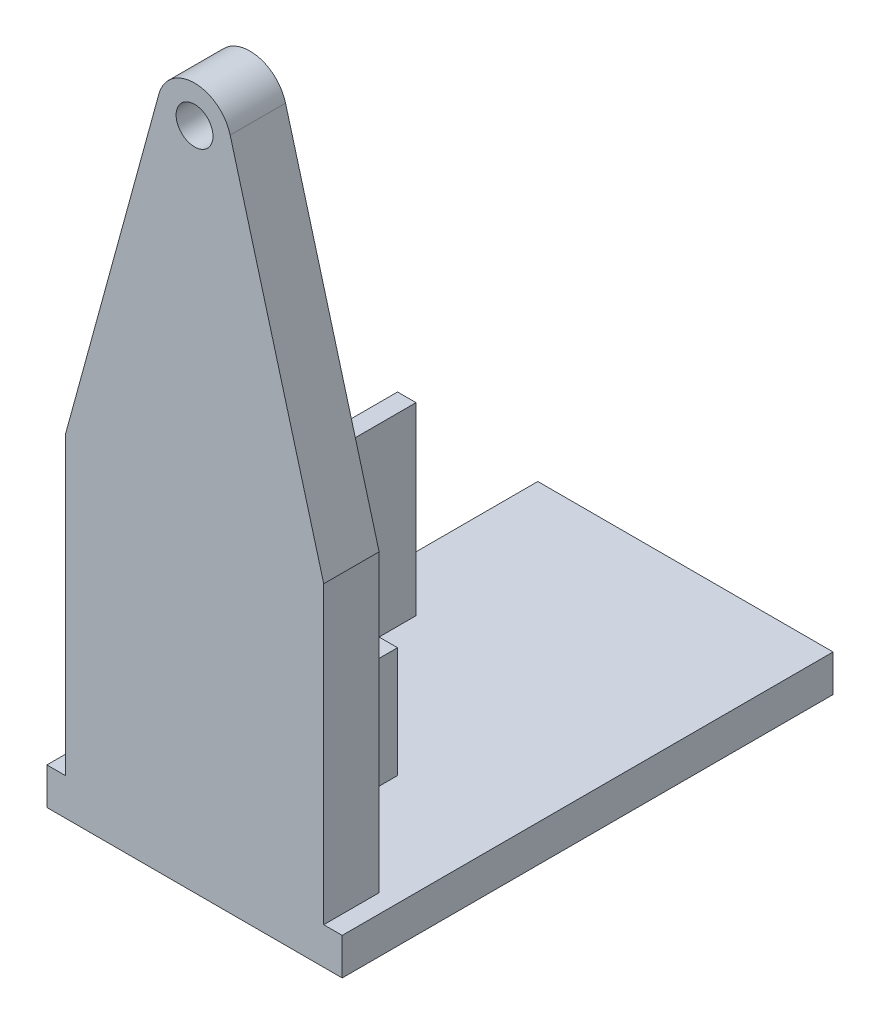
ISO-10303-21;
HEADER;
FILE_DESCRIPTION(('STEP AP214'),'2;1');
FILE_NAME('part.step','',(''),(''),'','','');
FILE_SCHEMA(('AUTOMOTIVE_DESIGN { 1 0 10303 214 1 1 1 1 }'));
ENDSEC;
DATA;
#1=APPLICATION_CONTEXT('core data for automotive mechanical design processes');
#2=APPLICATION_PROTOCOL_DEFINITION('international standard','automotive_design',2000,#1);
#3=PRODUCT_CONTEXT('',#1,'mechanical');
#4=PRODUCT('Part','Part','',(#3));
#5=PRODUCT_RELATED_PRODUCT_CATEGORY('part','',(#4));
#6=PRODUCT_DEFINITION_FORMATION('','',#4);
#7=PRODUCT_DEFINITION_CONTEXT('part definition',#1,'design');
#8=PRODUCT_DEFINITION('design','',#6,#7);
#9=PRODUCT_DEFINITION_SHAPE('','',#8);
#10=(LENGTH_UNIT() NAMED_UNIT(*) SI_UNIT(.MILLI.,.METRE.));
#11=(NAMED_UNIT(*) PLANE_ANGLE_UNIT() SI_UNIT($,.RADIAN.));
#12=(NAMED_UNIT(*) SI_UNIT($,.STERADIAN.) SOLID_ANGLE_UNIT());
#13=UNCERTAINTY_MEASURE_WITH_UNIT(LENGTH_MEASURE(1.E-05),#10,'distance_accuracy_value','');
#14=(GEOMETRIC_REPRESENTATION_CONTEXT(3) GLOBAL_UNCERTAINTY_ASSIGNED_CONTEXT((#13)) GLOBAL_UNIT_ASSIGNED_CONTEXT((#10,
#11,#12)) REPRESENTATION_CONTEXT('',''));
#15=CARTESIAN_POINT('',(0.,0.,0.));
#16=DIRECTION('',(0.,0.,1.));
#17=DIRECTION('',(1.,0.,0.));
#18=AXIS2_PLACEMENT_3D('',#15,#16,#17);
#19=CARTESIAN_POINT('',(0.,0.,0.));
#20=DIRECTION('',(0.,0.,1.));
#21=DIRECTION('',(1.,0.,0.));
#22=AXIS2_PLACEMENT_3D('',#19,#20,#21);
#23=PLANE('',#22);
#24=DIRECTION('',(0.,-1.,0.));
#25=VECTOR('',#24,1.);
#26=CARTESIAN_POINT('',(-10.,50.,0.));
#27=LINE('',#26,#25);
#28=CARTESIAN_POINT('',(-10.,100.,0.));
#29=VERTEX_POINT('',#28);
#30=CARTESIAN_POINT('',(-10.,50.,0.));
#31=VERTEX_POINT('',#30);
#32=EDGE_CURVE('E331',#29,#31,#27,.T.);
#33=ORIENTED_EDGE('',*,*,#32,.F.);
#34=DIRECTION('',(1.,0.,0.));
#35=VECTOR('',#34,1.);
#36=CARTESIAN_POINT('',(-10.,100.,0.));
#37=LINE('',#36,#35);
#38=CARTESIAN_POINT('',(-15.,100.,0.));
#39=VERTEX_POINT('',#38);
#40=EDGE_CURVE('E347',#39,#29,#37,.T.);
#41=ORIENTED_EDGE('',*,*,#40,.F.);
#42=DIRECTION('',(0.,1.,0.));
#43=VECTOR('',#42,1.);
#44=CARTESIAN_POINT('',(-15.,50.,0.));
#45=LINE('',#44,#43);
#46=CARTESIAN_POINT('',(-15.,50.,0.));
#47=VERTEX_POINT('',#46);
#48=EDGE_CURVE('E360',#47,#39,#45,.T.);
#49=ORIENTED_EDGE('',*,*,#48,.F.);
#50=DIRECTION('',(-1.,0.,0.));
#51=VECTOR('',#50,1.);
#52=CARTESIAN_POINT('',(-10.,50.,0.));
#53=LINE('',#52,#51);
#54=EDGE_CURVE('E336',#31,#47,#53,.T.);
#55=ORIENTED_EDGE('',*,*,#54,.F.);
#56=EDGE_LOOP('',(#33,#41,#49,#55));
#57=FACE_BOUND('',#56,.T.);
#58=CARTESIAN_POINT('',(0.,180.,0.));
#59=DIRECTION('',(0.,0.,1.));
#60=DIRECTION('',(1.,0.,0.));
#61=AXIS2_PLACEMENT_3D('',#58,#59,#60);
#62=CIRCLE('',#61,5.);
#63=CARTESIAN_POINT('',(5.,180.,0.));
#64=VERTEX_POINT('',#63);
#65=EDGE_CURVE('E435',#64,#64,#62,.T.);
#66=ORIENTED_EDGE('',*,*,#65,.T.);
#67=EDGE_LOOP('',(#66));
#68=FACE_BOUND('',#67,.T.);
#69=DIRECTION('',(0.,1.,0.));
#70=VECTOR('',#69,1.);
#71=CARTESIAN_POINT('',(-10.,10.,0.));
#72=LINE('',#71,#70);
#73=CARTESIAN_POINT('',(-10.,10.,0.));
#74=VERTEX_POINT('',#73);
#75=CARTESIAN_POINT('',(-10.,40.,0.));
#76=VERTEX_POINT('',#75);
#77=EDGE_CURVE('E382',#74,#76,#72,.T.);
#78=ORIENTED_EDGE('',*,*,#77,.F.);
#79=DIRECTION('',(1.,0.,0.));
#80=VECTOR('',#79,1.);
#81=CARTESIAN_POINT('',(40.,10.,0.));
#82=LINE('',#81,#80);
#83=CARTESIAN_POINT('',(-35.,10.,0.));
#84=VERTEX_POINT('',#83);
#85=EDGE_CURVE('E12',#84,#74,#82,.T.);
#86=ORIENTED_EDGE('',*,*,#85,.F.);
#87=DIRECTION('',(0.,1.,0.));
#88=VECTOR('',#87,1.);
#89=CARTESIAN_POINT('',(-35.,0.,0.));
#90=LINE('',#89,#88);
#91=CARTESIAN_POINT('',(-35.,90.,0.));
#92=VERTEX_POINT('',#91);
#93=EDGE_CURVE('E441',#84,#92,#90,.T.);
#94=ORIENTED_EDGE('',*,*,#93,.T.);
#95=DIRECTION('',(0.26398286591445,0.9645273694943,0.));
#96=VECTOR('',#95,1.);
#97=CARTESIAN_POINT('',(-55.4766395603085,15.1834802884977,0.));
#98=LINE('',#97,#96);
#99=CARTESIAN_POINT('',(-9.64527369494302,182.639828659144,0.));
#100=VERTEX_POINT('',#99);
#101=EDGE_CURVE('E472',#92,#100,#98,.T.);
#102=ORIENTED_EDGE('',*,*,#101,.T.);
#103=CARTESIAN_POINT('',(0.,180.,0.));
#104=DIRECTION('',(0.,0.,1.));
#105=DIRECTION('',(1.,0.,0.));
#106=AXIS2_PLACEMENT_3D('',#103,#104,#105);
#107=CIRCLE('',#106,10.);
#108=CARTESIAN_POINT('',(9.65615758520671,182.599734734479,0.));
#109=VERTEX_POINT('',#108);
#110=EDGE_CURVE('E159',#109,#100,#107,.T.);
#111=ORIENTED_EDGE('',*,*,#110,.F.);
#112=DIRECTION('',(-0.263983732927113,0.964527132199954,0.));
#113=VECTOR('',#112,1.);
#114=CARTESIAN_POINT('',(55.4766931643317,15.1835485628789,0.));
#115=LINE('',#114,#113);
#116=CARTESIAN_POINT('',(35.,90.,0.));
#117=VERTEX_POINT('',#116);
#118=EDGE_CURVE('E467',#117,#109,#115,.T.);
#119=ORIENTED_EDGE('',*,*,#118,.F.);
#120=DIRECTION('',(0.,1.,0.));
#121=VECTOR('',#120,1.);
#122=CARTESIAN_POINT('',(35.,0.,0.));
#123=LINE('',#122,#121);
#124=CARTESIAN_POINT('',(35.,10.,0.));
#125=VERTEX_POINT('',#124);
#126=EDGE_CURVE('E464',#125,#117,#123,.T.);
#127=ORIENTED_EDGE('',*,*,#126,.F.);
#128=CARTESIAN_POINT('',(9.99999999999999,10.,0.));
#129=VERTEX_POINT('',#128);
#130=EDGE_CURVE('E165',#129,#125,#82,.T.);
#131=ORIENTED_EDGE('',*,*,#130,.F.);
#132=DIRECTION('',(0.,-1.,0.));
#133=VECTOR('',#132,1.);
#134=CARTESIAN_POINT('',(9.99999999999999,10.,0.));
#135=LINE('',#134,#133);
#136=CARTESIAN_POINT('',(10.,40.,0.));
#137=VERTEX_POINT('',#136);
#138=EDGE_CURVE('E388',#137,#129,#135,.T.);
#139=ORIENTED_EDGE('',*,*,#138,.F.);
#140=DIRECTION('',(1.,0.,0.));
#141=VECTOR('',#140,1.);
#142=CARTESIAN_POINT('',(-10.,40.,0.));
#143=LINE('',#142,#141);
#144=EDGE_CURVE('E402',#76,#137,#143,.T.);
#145=ORIENTED_EDGE('',*,*,#144,.F.);
#146=EDGE_LOOP('',(#78,#86,#94,#102,#111,#119,#127,#131,#139,#145));
#147=FACE_BOUND('',#146,.T.);
#148=DIRECTION('',(0.,1.,0.));
#149=VECTOR('',#148,1.);
#150=CARTESIAN_POINT('',(9.99999999999999,50.,0.));
#151=LINE('',#150,#149);
#152=CARTESIAN_POINT('',(9.99999999999999,50.,0.));
#153=VERTEX_POINT('',#152);
#154=CARTESIAN_POINT('',(9.99999999999999,100.,0.));
#155=VERTEX_POINT('',#154);
#156=EDGE_CURVE('E329',#153,#155,#151,.T.);
#157=ORIENTED_EDGE('',*,*,#156,.F.);
#158=DIRECTION('',(-1.,0.,0.));
#159=VECTOR('',#158,1.);
#160=CARTESIAN_POINT('',(9.99999999999999,50.,0.));
#161=LINE('',#160,#159);
#162=CARTESIAN_POINT('',(15.,50.,0.));
#163=VERTEX_POINT('',#162);
#164=EDGE_CURVE('E326',#163,#153,#161,.T.);
#165=ORIENTED_EDGE('',*,*,#164,.F.);
#166=DIRECTION('',(0.,-1.,0.));
#167=VECTOR('',#166,1.);
#168=CARTESIAN_POINT('',(15.,50.,0.));
#169=LINE('',#168,#167);
#170=CARTESIAN_POINT('',(15.,100.,0.));
#171=VERTEX_POINT('',#170);
#172=EDGE_CURVE('E178',#171,#163,#169,.T.);
#173=ORIENTED_EDGE('',*,*,#172,.F.);
#174=DIRECTION('',(1.,0.,0.));
#175=VECTOR('',#174,1.);
#176=CARTESIAN_POINT('',(9.99999999999999,100.,0.));
#177=LINE('',#176,#175);
#178=EDGE_CURVE('E173',#155,#171,#177,.T.);
#179=ORIENTED_EDGE('',*,*,#178,.F.);
#180=EDGE_LOOP('',(#157,#165,#173,#179));
#181=FACE_BOUND('',#180,.T.);
#182=ADVANCED_FACE('F155',(#57,#68,#147,#181),#23,.F.);
#183=CARTESIAN_POINT('',(0.,10.,15.));
#184=DIRECTION('',(0.,-1.,0.));
#185=DIRECTION('',(0.,0.,-1.));
#186=AXIS2_PLACEMENT_3D('',#183,#184,#185);
#187=PLANE('',#186);
#188=DIRECTION('',(0.,0.,1.));
#189=VECTOR('',#188,1.);
#190=CARTESIAN_POINT('',(-10.,10.,-30.));
#191=LINE('',#190,#189);
#192=CARTESIAN_POINT('',(-10.,10.,-30.));
#193=VERTEX_POINT('',#192);
#194=EDGE_CURVE('E398',#193,#74,#191,.T.);
#195=ORIENTED_EDGE('',*,*,#194,.F.);
#196=DIRECTION('',(-1.,0.,0.));
#197=VECTOR('',#196,1.);
#198=CARTESIAN_POINT('',(9.99999999999999,10.,-30.));
#199=LINE('',#198,#197);
#200=CARTESIAN_POINT('',(10.,10.,-30.));
#201=VERTEX_POINT('',#200);
#202=EDGE_CURVE('E395',#201,#193,#199,.T.);
#203=ORIENTED_EDGE('',*,*,#202,.F.);
#204=DIRECTION('',(0.,0.,1.));
#205=VECTOR('',#204,1.);
#206=CARTESIAN_POINT('',(9.99999999999999,10.,-30.));
#207=LINE('',#206,#205);
#208=EDGE_CURVE('E409',#201,#129,#207,.T.);
#209=ORIENTED_EDGE('',*,*,#208,.T.);
#210=ORIENTED_EDGE('',*,*,#130,.T.);
#211=DIRECTION('',(0.,0.,-1.));
#212=VECTOR('',#211,1.);
#213=CARTESIAN_POINT('',(35.,10.,15.));
#214=LINE('',#213,#212);
#215=CARTESIAN_POINT('',(35.,10.,15.));
#216=VERTEX_POINT('',#215);
#217=EDGE_CURVE('E495',#216,#125,#214,.T.);
#218=ORIENTED_EDGE('',*,*,#217,.F.);
#219=DIRECTION('',(-1.,0.,0.));
#220=VECTOR('',#219,1.);
#221=CARTESIAN_POINT('',(0.,10.,15.));
#222=LINE('',#221,#220);
#223=CARTESIAN_POINT('',(40.,10.,15.));
#224=VERTEX_POINT('',#223);
#225=EDGE_CURVE('E444',#224,#216,#222,.T.);
#226=ORIENTED_EDGE('',*,*,#225,.F.);
#227=DIRECTION('',(0.,0.,-1.));
#228=VECTOR('',#227,1.);
#229=CARTESIAN_POINT('',(40.,10.,15.));
#230=LINE('',#229,#228);
#231=CARTESIAN_POINT('',(40.,10.,-118.));
#232=VERTEX_POINT('',#231);
#233=EDGE_CURVE('E499',#224,#232,#230,.T.);
#234=ORIENTED_EDGE('',*,*,#233,.T.);
#235=DIRECTION('',(1.,0.,0.));
#236=VECTOR('',#235,1.);
#237=CARTESIAN_POINT('',(40.,10.,-118.));
#238=LINE('',#237,#236);
#239=CARTESIAN_POINT('',(-40.,10.,-118.));
#240=VERTEX_POINT('',#239);
#241=EDGE_CURVE('E432',#240,#232,#238,.T.);
#242=ORIENTED_EDGE('',*,*,#241,.F.);
#243=DIRECTION('',(0.,0.,-1.));
#244=VECTOR('',#243,1.);
#245=CARTESIAN_POINT('',(-40.,10.,15.));
#246=LINE('',#245,#244);
#247=CARTESIAN_POINT('',(-40.,10.,15.));
#248=VERTEX_POINT('',#247);
#249=EDGE_CURVE('E513',#248,#240,#246,.T.);
#250=ORIENTED_EDGE('',*,*,#249,.F.);
#251=DIRECTION('',(-1.,0.,0.));
#252=VECTOR('',#251,1.);
#253=CARTESIAN_POINT('',(40.,10.,15.));
#254=LINE('',#253,#252);
#255=CARTESIAN_POINT('',(-35.,10.,15.));
#256=VERTEX_POINT('',#255);
#257=EDGE_CURVE('E509',#256,#248,#254,.T.);
#258=ORIENTED_EDGE('',*,*,#257,.F.);
#259=DIRECTION('',(0.,0.,-1.));
#260=VECTOR('',#259,1.);
#261=CARTESIAN_POINT('',(-35.,10.,15.));
#262=LINE('',#261,#260);
#263=EDGE_CURVE('E463',#256,#84,#262,.T.);
#264=ORIENTED_EDGE('',*,*,#263,.T.);
#265=ORIENTED_EDGE('',*,*,#85,.T.);
#266=EDGE_LOOP('',(#195,#203,#209,#210,#218,#226,#234,#242,#250,#258,#264,#265));
#267=FACE_BOUND('',#266,.T.);
#268=ADVANCED_FACE('F549',(#267),#187,.F.);
#269=CARTESIAN_POINT('',(0.,0.,15.));
#270=DIRECTION('',(0.,1.,0.));
#271=DIRECTION('',(0.,0.,1.));
#272=AXIS2_PLACEMENT_3D('',#269,#270,#271);
#273=PLANE('',#272);
#274=DIRECTION('',(0.,0.,-1.));
#275=VECTOR('',#274,1.);
#276=CARTESIAN_POINT('',(-40.,0.,15.));
#277=LINE('',#276,#275);
#278=CARTESIAN_POINT('',(-40.,0.,15.));
#279=VERTEX_POINT('',#278);
#280=CARTESIAN_POINT('',(-40.,0.,-118.));
#281=VERTEX_POINT('',#280);
#282=EDGE_CURVE('E468',#279,#281,#277,.T.);
#283=ORIENTED_EDGE('',*,*,#282,.T.);
#284=DIRECTION('',(-1.,0.,0.));
#285=VECTOR('',#284,1.);
#286=CARTESIAN_POINT('',(40.,0.,-118.));
#287=LINE('',#286,#285);
#288=CARTESIAN_POINT('',(40.,0.,-118.));
#289=VERTEX_POINT('',#288);
#290=EDGE_CURVE('E424',#289,#281,#287,.T.);
#291=ORIENTED_EDGE('',*,*,#290,.F.);
#292=DIRECTION('',(0.,0.,-1.));
#293=VECTOR('',#292,1.);
#294=CARTESIAN_POINT('',(40.,0.,15.));
#295=LINE('',#294,#293);
#296=CARTESIAN_POINT('',(40.,0.,15.));
#297=VERTEX_POINT('',#296);
#298=EDGE_CURVE('E502',#297,#289,#295,.T.);
#299=ORIENTED_EDGE('',*,*,#298,.F.);
#300=DIRECTION('',(1.,0.,0.));
#301=VECTOR('',#300,1.);
#302=CARTESIAN_POINT('',(0.,0.,15.));
#303=LINE('',#302,#301);
#304=EDGE_CURVE('E437',#279,#297,#303,.T.);
#305=ORIENTED_EDGE('',*,*,#304,.F.);
#306=EDGE_LOOP('',(#283,#291,#299,#305));
#307=FACE_BOUND('',#306,.T.);
#308=ADVANCED_FACE('F559',(#307),#273,.F.);
#309=CARTESIAN_POINT('',(40.,0.,15.));
#310=DIRECTION('',(-1.,0.,0.));
#311=DIRECTION('',(0.,0.,1.));
#312=AXIS2_PLACEMENT_3D('',#309,#310,#311);
#313=PLANE('',#312);
#314=ORIENTED_EDGE('',*,*,#298,.T.);
#315=DIRECTION('',(0.,-1.,0.));
#316=VECTOR('',#315,1.);
#317=CARTESIAN_POINT('',(40.,0.,-118.));
#318=LINE('',#317,#316);
#319=EDGE_CURVE('E420',#232,#289,#318,.T.);
#320=ORIENTED_EDGE('',*,*,#319,.F.);
#321=ORIENTED_EDGE('',*,*,#233,.F.);
#322=DIRECTION('',(0.,1.,0.));
#323=VECTOR('',#322,1.);
#324=CARTESIAN_POINT('',(40.,0.,15.));
#325=LINE('',#324,#323);
#326=EDGE_CURVE('E440',#297,#224,#325,.T.);
#327=ORIENTED_EDGE('',*,*,#326,.F.);
#328=EDGE_LOOP('',(#314,#320,#321,#327));
#329=FACE_BOUND('',#328,.T.);
#330=ADVANCED_FACE('F565',(#329),#313,.F.);
#331=CARTESIAN_POINT('',(55.4766931643317,15.1835485628789,15.));
#332=DIRECTION('',(-0.964527132199954,-0.263983732927113,0.));
#333=DIRECTION('',(0.263983732927113,-0.964527132199954,0.));
#334=AXIS2_PLACEMENT_3D('',#331,#332,#333);
#335=PLANE('',#334);
#336=ORIENTED_EDGE('',*,*,#118,.T.);
#337=DIRECTION('',(0.,0.,-1.));
#338=VECTOR('',#337,1.);
#339=CARTESIAN_POINT('',(9.65615758520671,182.599734734479,15.));
#340=LINE('',#339,#338);
#341=CARTESIAN_POINT('',(9.65615758520671,182.599734734479,15.));
#342=VERTEX_POINT('',#341);
#343=EDGE_CURVE('E488',#342,#109,#340,.T.);
#344=ORIENTED_EDGE('',*,*,#343,.F.);
#345=DIRECTION('',(-0.263983732927113,0.964527132199954,0.));
#346=VECTOR('',#345,1.);
#347=CARTESIAN_POINT('',(55.4766931643317,15.1835485628789,15.));
#348=LINE('',#347,#346);
#349=CARTESIAN_POINT('',(35.,90.,15.));
#350=VERTEX_POINT('',#349);
#351=EDGE_CURVE('E451',#350,#342,#348,.T.);
#352=ORIENTED_EDGE('',*,*,#351,.F.);
#353=DIRECTION('',(0.,0.,-1.));
#354=VECTOR('',#353,1.);
#355=CARTESIAN_POINT('',(35.,90.,15.));
#356=LINE('',#355,#354);
#357=EDGE_CURVE('E491',#350,#117,#356,.T.);
#358=ORIENTED_EDGE('',*,*,#357,.T.);
#359=EDGE_LOOP('',(#336,#344,#352,#358));
#360=FACE_BOUND('',#359,.T.);
#361=ADVANCED_FACE('F575',(#360),#335,.F.);
#362=CARTESIAN_POINT('',(-55.4766395603085,15.1834802884977,15.));
#363=DIRECTION('',(-0.9645273694943,0.26398286591445,0.));
#364=DIRECTION('',(-0.26398286591445,-0.9645273694943,0.));
#365=AXIS2_PLACEMENT_3D('',#362,#363,#364);
#366=PLANE('',#365);
#367=ORIENTED_EDGE('',*,*,#101,.F.);
#368=DIRECTION('',(0.,0.,-1.));
#369=VECTOR('',#368,1.);
#370=CARTESIAN_POINT('',(-35.,90.,15.));
#371=LINE('',#370,#369);
#372=CARTESIAN_POINT('',(-35.,90.,15.));
#373=VERTEX_POINT('',#372);
#374=EDGE_CURVE('E482',#373,#92,#371,.T.);
#375=ORIENTED_EDGE('',*,*,#374,.F.);
#376=DIRECTION('',(0.26398286591445,0.9645273694943,0.));
#377=VECTOR('',#376,1.);
#378=CARTESIAN_POINT('',(-55.4766395603085,15.1834802884977,15.));
#379=LINE('',#378,#377);
#380=CARTESIAN_POINT('',(-9.64527369494302,182.639828659144,15.));
#381=VERTEX_POINT('',#380);
#382=EDGE_CURVE('E455',#373,#381,#379,.T.);
#383=ORIENTED_EDGE('',*,*,#382,.T.);
#384=DIRECTION('',(0.,0.,-1.));
#385=VECTOR('',#384,1.);
#386=CARTESIAN_POINT('',(-9.64527369494302,182.639828659144,15.));
#387=LINE('',#386,#385);
#388=EDGE_CURVE('E485',#381,#100,#387,.T.);
#389=ORIENTED_EDGE('',*,*,#388,.T.);
#390=EDGE_LOOP('',(#367,#375,#383,#389));
#391=FACE_BOUND('',#390,.T.);
#392=ADVANCED_FACE('F539',(#391),#366,.T.);
#393=CARTESIAN_POINT('',(-35.,0.,15.));
#394=DIRECTION('',(-1.,0.,0.));
#395=DIRECTION('',(0.,0.,1.));
#396=AXIS2_PLACEMENT_3D('',#393,#394,#395);
#397=PLANE('',#396);
#398=ORIENTED_EDGE('',*,*,#93,.F.);
#399=ORIENTED_EDGE('',*,*,#263,.F.);
#400=DIRECTION('',(0.,1.,0.));
#401=VECTOR('',#400,1.);
#402=CARTESIAN_POINT('',(-35.,0.,15.));
#403=LINE('',#402,#401);
#404=EDGE_CURVE('E459',#256,#373,#403,.T.);
#405=ORIENTED_EDGE('',*,*,#404,.T.);
#406=ORIENTED_EDGE('',*,*,#374,.T.);
#407=EDGE_LOOP('',(#398,#399,#405,#406));
#408=FACE_BOUND('',#407,.T.);
#409=ADVANCED_FACE('F544',(#408),#397,.T.);
#410=CARTESIAN_POINT('',(35.,0.,15.));
#411=DIRECTION('',(-1.,0.,0.));
#412=DIRECTION('',(0.,0.,1.));
#413=AXIS2_PLACEMENT_3D('',#410,#411,#412);
#414=PLANE('',#413);
#415=ORIENTED_EDGE('',*,*,#126,.T.);
#416=ORIENTED_EDGE('',*,*,#357,.F.);
#417=DIRECTION('',(0.,1.,0.));
#418=VECTOR('',#417,1.);
#419=CARTESIAN_POINT('',(35.,0.,15.));
#420=LINE('',#419,#418);
#421=EDGE_CURVE('E448',#216,#350,#420,.T.);
#422=ORIENTED_EDGE('',*,*,#421,.F.);
#423=ORIENTED_EDGE('',*,*,#217,.T.);
#424=EDGE_LOOP('',(#415,#416,#422,#423));
#425=FACE_BOUND('',#424,.T.);
#426=ADVANCED_FACE('F571',(#425),#414,.F.);
#427=CARTESIAN_POINT('',(0.,0.,15.));
#428=DIRECTION('',(0.,0.,1.));
#429=DIRECTION('',(1.,0.,0.));
#430=AXIS2_PLACEMENT_3D('',#427,#428,#429);
#431=PLANE('',#430);
#432=ORIENTED_EDGE('',*,*,#404,.F.);
#433=ORIENTED_EDGE('',*,*,#257,.T.);
#434=DIRECTION('',(0.,1.,0.));
#435=VECTOR('',#434,1.);
#436=CARTESIAN_POINT('',(-40.,0.,15.));
#437=LINE('',#436,#435);
#438=EDGE_CURVE('E505',#279,#248,#437,.T.);
#439=ORIENTED_EDGE('',*,*,#438,.F.);
#440=ORIENTED_EDGE('',*,*,#304,.T.);
#441=ORIENTED_EDGE('',*,*,#326,.T.);
#442=ORIENTED_EDGE('',*,*,#225,.T.);
#443=ORIENTED_EDGE('',*,*,#421,.T.);
#444=ORIENTED_EDGE('',*,*,#351,.T.);
#445=CARTESIAN_POINT('',(0.,180.,15.));
#446=DIRECTION('',(0.,0.,1.));
#447=DIRECTION('',(1.,0.,0.));
#448=AXIS2_PLACEMENT_3D('',#445,#446,#447);
#449=CIRCLE('',#448,10.);
#450=EDGE_CURVE('E510',#342,#381,#449,.T.);
#451=ORIENTED_EDGE('',*,*,#450,.T.);
#452=ORIENTED_EDGE('',*,*,#382,.F.);
#453=EDGE_LOOP('',(#432,#433,#439,#440,#441,#442,#443,#444,#451,#452));
#454=FACE_BOUND('',#453,.T.);
#455=CARTESIAN_POINT('',(0.,180.,15.));
#456=DIRECTION('',(0.,0.,1.));
#457=DIRECTION('',(1.,0.,0.));
#458=AXIS2_PLACEMENT_3D('',#455,#456,#457);
#459=CIRCLE('',#458,5.);
#460=CARTESIAN_POINT('',(5.,180.,15.));
#461=VERTEX_POINT('',#460);
#462=EDGE_CURVE('E518',#461,#461,#459,.T.);
#463=ORIENTED_EDGE('',*,*,#462,.F.);
#464=EDGE_LOOP('',(#463));
#465=FACE_BOUND('',#464,.T.);
#466=ADVANCED_FACE('F541',(#454,#465),#431,.T.);
#467=CARTESIAN_POINT('',(0.,180.,15.));
#468=DIRECTION('',(0.,0.,-1.));
#469=DIRECTION('',(-1.,0.,0.));
#470=AXIS2_PLACEMENT_3D('',#467,#468,#469);
#471=CYLINDRICAL_SURFACE('',#470,5.);
#472=ORIENTED_EDGE('',*,*,#462,.T.);
#473=EDGE_LOOP('',(#472));
#474=FACE_BOUND('',#473,.T.);
#475=ORIENTED_EDGE('',*,*,#65,.F.);
#476=EDGE_LOOP('',(#475));
#477=FACE_BOUND('',#476,.T.);
#478=ADVANCED_FACE('F624',(#474,#477),#471,.F.);
#479=CARTESIAN_POINT('',(0.,180.,15.));
#480=DIRECTION('',(0.,0.,-1.));
#481=DIRECTION('',(-1.,0.,0.));
#482=AXIS2_PLACEMENT_3D('',#479,#480,#481);
#483=CYLINDRICAL_SURFACE('',#482,10.);
#484=ORIENTED_EDGE('',*,*,#450,.F.);
#485=ORIENTED_EDGE('',*,*,#343,.T.);
#486=ORIENTED_EDGE('',*,*,#110,.T.);
#487=ORIENTED_EDGE('',*,*,#388,.F.);
#488=EDGE_LOOP('',(#484,#485,#486,#487));
#489=FACE_BOUND('',#488,.T.);
#490=ADVANCED_FACE('F157',(#489),#483,.T.);
#491=CARTESIAN_POINT('',(-40.,0.,15.));
#492=DIRECTION('',(-1.,0.,0.));
#493=DIRECTION('',(0.,0.,1.));
#494=AXIS2_PLACEMENT_3D('',#491,#492,#493);
#495=PLANE('',#494);
#496=ORIENTED_EDGE('',*,*,#249,.T.);
#497=DIRECTION('',(0.,1.,0.));
#498=VECTOR('',#497,1.);
#499=CARTESIAN_POINT('',(-40.,0.,-118.));
#500=LINE('',#499,#498);
#501=EDGE_CURVE('E428',#281,#240,#500,.T.);
#502=ORIENTED_EDGE('',*,*,#501,.F.);
#503=ORIENTED_EDGE('',*,*,#282,.F.);
#504=ORIENTED_EDGE('',*,*,#438,.T.);
#505=EDGE_LOOP('',(#496,#502,#503,#504));
#506=FACE_BOUND('',#505,.T.);
#507=ADVANCED_FACE('F555',(#506),#495,.T.);
#508=CARTESIAN_POINT('',(0.,0.,-118.));
#509=DIRECTION('',(0.,0.,1.));
#510=DIRECTION('',(1.,0.,0.));
#511=AXIS2_PLACEMENT_3D('',#508,#509,#510);
#512=PLANE('',#511);
#513=ORIENTED_EDGE('',*,*,#319,.T.);
#514=ORIENTED_EDGE('',*,*,#290,.T.);
#515=ORIENTED_EDGE('',*,*,#501,.T.);
#516=ORIENTED_EDGE('',*,*,#241,.T.);
#517=EDGE_LOOP('',(#513,#514,#515,#516));
#518=FACE_BOUND('',#517,.T.);
#519=ADVANCED_FACE('F561',(#518),#512,.F.);
#520=CARTESIAN_POINT('',(-10.,10.,-30.));
#521=DIRECTION('',(1.,0.,0.));
#522=DIRECTION('',(0.,0.,-1.));
#523=AXIS2_PLACEMENT_3D('',#520,#521,#522);
#524=PLANE('',#523);
#525=ORIENTED_EDGE('',*,*,#77,.T.);
#526=DIRECTION('',(0.,0.,1.));
#527=VECTOR('',#526,1.);
#528=CARTESIAN_POINT('',(-10.,40.,-30.));
#529=LINE('',#528,#527);
#530=CARTESIAN_POINT('',(-10.,40.,-30.));
#531=VERTEX_POINT('',#530);
#532=EDGE_CURVE('E417',#531,#76,#529,.T.);
#533=ORIENTED_EDGE('',*,*,#532,.F.);
#534=DIRECTION('',(0.,1.,0.));
#535=VECTOR('',#534,1.);
#536=CARTESIAN_POINT('',(-10.,10.,-30.));
#537=LINE('',#536,#535);
#538=EDGE_CURVE('E383',#193,#531,#537,.T.);
#539=ORIENTED_EDGE('',*,*,#538,.F.);
#540=ORIENTED_EDGE('',*,*,#194,.T.);
#541=EDGE_LOOP('',(#525,#533,#539,#540));
#542=FACE_BOUND('',#541,.T.);
#543=ADVANCED_FACE('F592',(#542),#524,.F.);
#544=CARTESIAN_POINT('',(-10.,40.,-30.));
#545=DIRECTION('',(0.,-1.,0.));
#546=DIRECTION('',(1.,0.,0.));
#547=AXIS2_PLACEMENT_3D('',#544,#545,#546);
#548=PLANE('',#547);
#549=ORIENTED_EDGE('',*,*,#144,.T.);
#550=DIRECTION('',(0.,0.,1.));
#551=VECTOR('',#550,1.);
#552=CARTESIAN_POINT('',(10.,40.,-30.));
#553=LINE('',#552,#551);
#554=CARTESIAN_POINT('',(10.,40.,-30.));
#555=VERTEX_POINT('',#554);
#556=EDGE_CURVE('E413',#555,#137,#553,.T.);
#557=ORIENTED_EDGE('',*,*,#556,.F.);
#558=DIRECTION('',(1.,0.,0.));
#559=VECTOR('',#558,1.);
#560=CARTESIAN_POINT('',(-10.,40.,-30.));
#561=LINE('',#560,#559);
#562=EDGE_CURVE('E387',#531,#555,#561,.T.);
#563=ORIENTED_EDGE('',*,*,#562,.F.);
#564=ORIENTED_EDGE('',*,*,#532,.T.);
#565=EDGE_LOOP('',(#549,#557,#563,#564));
#566=FACE_BOUND('',#565,.T.);
#567=ADVANCED_FACE('F590',(#566),#548,.F.);
#568=CARTESIAN_POINT('',(9.99999999999999,10.,-30.));
#569=DIRECTION('',(-1.,0.,0.));
#570=DIRECTION('',(0.,-1.,0.));
#571=AXIS2_PLACEMENT_3D('',#568,#569,#570);
#572=PLANE('',#571);
#573=ORIENTED_EDGE('',*,*,#138,.T.);
#574=ORIENTED_EDGE('',*,*,#208,.F.);
#575=DIRECTION('',(0.,-1.,0.));
#576=VECTOR('',#575,1.);
#577=CARTESIAN_POINT('',(9.99999999999999,10.,-30.));
#578=LINE('',#577,#576);
#579=EDGE_CURVE('E391',#555,#201,#578,.T.);
#580=ORIENTED_EDGE('',*,*,#579,.F.);
#581=ORIENTED_EDGE('',*,*,#556,.T.);
#582=EDGE_LOOP('',(#573,#574,#580,#581));
#583=FACE_BOUND('',#582,.T.);
#584=ADVANCED_FACE('F583',(#583),#572,.F.);
#585=CARTESIAN_POINT('',(0.,0.,-30.));
#586=DIRECTION('',(0.,0.,-1.));
#587=DIRECTION('',(-1.,0.,0.));
#588=AXIS2_PLACEMENT_3D('',#585,#586,#587);
#589=PLANE('',#588);
#590=ORIENTED_EDGE('',*,*,#538,.T.);
#591=ORIENTED_EDGE('',*,*,#562,.T.);
#592=ORIENTED_EDGE('',*,*,#579,.T.);
#593=ORIENTED_EDGE('',*,*,#202,.T.);
#594=EDGE_LOOP('',(#590,#591,#592,#593));
#595=FACE_BOUND('',#594,.T.);
#596=ADVANCED_FACE('F585',(#595),#589,.T.);
#597=CARTESIAN_POINT('',(-10.,50.,-30.));
#598=DIRECTION('',(-1.,0.,0.));
#599=DIRECTION('',(0.,0.,1.));
#600=AXIS2_PLACEMENT_3D('',#597,#598,#599);
#601=PLANE('',#600);
#602=ORIENTED_EDGE('',*,*,#32,.T.);
#603=DIRECTION('',(0.,0.,1.));
#604=VECTOR('',#603,1.);
#605=CARTESIAN_POINT('',(-10.,50.,-30.));
#606=LINE('',#605,#604);
#607=CARTESIAN_POINT('',(-10.,50.,-30.));
#608=VERTEX_POINT('',#607);
#609=EDGE_CURVE('E378',#608,#31,#606,.T.);
#610=ORIENTED_EDGE('',*,*,#609,.F.);
#611=DIRECTION('',(0.,-1.,0.));
#612=VECTOR('',#611,1.);
#613=CARTESIAN_POINT('',(-10.,50.,-30.));
#614=LINE('',#613,#612);
#615=CARTESIAN_POINT('',(-10.,100.,-30.));
#616=VERTEX_POINT('',#615);
#617=EDGE_CURVE('E342',#616,#608,#614,.T.);
#618=ORIENTED_EDGE('',*,*,#617,.F.);
#619=DIRECTION('',(0.,0.,1.));
#620=VECTOR('',#619,1.);
#621=CARTESIAN_POINT('',(-10.,100.,-30.));
#622=LINE('',#621,#620);
#623=EDGE_CURVE('E355',#616,#29,#622,.T.);
#624=ORIENTED_EDGE('',*,*,#623,.T.);
#625=EDGE_LOOP('',(#602,#610,#618,#624));
#626=FACE_BOUND('',#625,.T.);
#627=ADVANCED_FACE('F698',(#626),#601,.F.);
#628=CARTESIAN_POINT('',(-10.,50.,-30.));
#629=DIRECTION('',(0.,1.,0.));
#630=DIRECTION('',(0.,0.,1.));
#631=AXIS2_PLACEMENT_3D('',#628,#629,#630);
#632=PLANE('',#631);
#633=ORIENTED_EDGE('',*,*,#54,.T.);
#634=DIRECTION('',(0.,0.,1.));
#635=VECTOR('',#634,1.);
#636=CARTESIAN_POINT('',(-15.,50.,-30.));
#637=LINE('',#636,#635);
#638=CARTESIAN_POINT('',(-15.,50.,-30.));
#639=VERTEX_POINT('',#638);
#640=EDGE_CURVE('E374',#639,#47,#637,.T.);
#641=ORIENTED_EDGE('',*,*,#640,.F.);
#642=DIRECTION('',(-1.,0.,0.));
#643=VECTOR('',#642,1.);
#644=CARTESIAN_POINT('',(-10.,50.,-30.));
#645=LINE('',#644,#643);
#646=EDGE_CURVE('E346',#608,#639,#645,.T.);
#647=ORIENTED_EDGE('',*,*,#646,.F.);
#648=ORIENTED_EDGE('',*,*,#609,.T.);
#649=EDGE_LOOP('',(#633,#641,#647,#648));
#650=FACE_BOUND('',#649,.T.);
#651=ADVANCED_FACE('F707',(#650),#632,.F.);
#652=CARTESIAN_POINT('',(-15.,50.,-30.));
#653=DIRECTION('',(1.,0.,0.));
#654=DIRECTION('',(0.,0.,-1.));
#655=AXIS2_PLACEMENT_3D('',#652,#653,#654);
#656=PLANE('',#655);
#657=ORIENTED_EDGE('',*,*,#48,.T.);
#658=DIRECTION('',(0.,0.,1.));
#659=VECTOR('',#658,1.);
#660=CARTESIAN_POINT('',(-15.,100.,-30.));
#661=LINE('',#660,#659);
#662=CARTESIAN_POINT('',(-15.,100.,-30.));
#663=VERTEX_POINT('',#662);
#664=EDGE_CURVE('E370',#663,#39,#661,.T.);
#665=ORIENTED_EDGE('',*,*,#664,.F.);
#666=DIRECTION('',(0.,1.,0.));
#667=VECTOR('',#666,1.);
#668=CARTESIAN_POINT('',(-15.,50.,-30.));
#669=LINE('',#668,#667);
#670=EDGE_CURVE('E350',#639,#663,#669,.T.);
#671=ORIENTED_EDGE('',*,*,#670,.F.);
#672=ORIENTED_EDGE('',*,*,#640,.T.);
#673=EDGE_LOOP('',(#657,#665,#671,#672));
#674=FACE_BOUND('',#673,.T.);
#675=ADVANCED_FACE('F717',(#674),#656,.F.);
#676=CARTESIAN_POINT('',(-10.,100.,-30.));
#677=DIRECTION('',(0.,-1.,0.));
#678=DIRECTION('',(0.,0.,-1.));
#679=AXIS2_PLACEMENT_3D('',#676,#677,#678);
#680=PLANE('',#679);
#681=ORIENTED_EDGE('',*,*,#40,.T.);
#682=ORIENTED_EDGE('',*,*,#623,.F.);
#683=DIRECTION('',(1.,0.,0.));
#684=VECTOR('',#683,1.);
#685=CARTESIAN_POINT('',(-10.,100.,-30.));
#686=LINE('',#685,#684);
#687=EDGE_CURVE('E353',#663,#616,#686,.T.);
#688=ORIENTED_EDGE('',*,*,#687,.F.);
#689=ORIENTED_EDGE('',*,*,#664,.T.);
#690=EDGE_LOOP('',(#681,#682,#688,#689));
#691=FACE_BOUND('',#690,.T.);
#692=ADVANCED_FACE('F727',(#691),#680,.F.);
#693=CARTESIAN_POINT('',(0.,0.,-30.));
#694=DIRECTION('',(0.,0.,1.));
#695=DIRECTION('',(1.,0.,0.));
#696=AXIS2_PLACEMENT_3D('',#693,#694,#695);
#697=PLANE('',#696);
#698=ORIENTED_EDGE('',*,*,#617,.T.);
#699=ORIENTED_EDGE('',*,*,#646,.T.);
#700=ORIENTED_EDGE('',*,*,#670,.T.);
#701=ORIENTED_EDGE('',*,*,#687,.T.);
#702=EDGE_LOOP('',(#698,#699,#700,#701));
#703=FACE_BOUND('',#702,.T.);
#704=ADVANCED_FACE('F737',(#703),#697,.F.);
#705=CARTESIAN_POINT('',(9.99999999999999,50.,-30.));
#706=DIRECTION('',(1.,0.,0.));
#707=DIRECTION('',(0.,1.,0.));
#708=AXIS2_PLACEMENT_3D('',#705,#706,#707);
#709=PLANE('',#708);
#710=ORIENTED_EDGE('',*,*,#156,.T.);
#711=DIRECTION('',(0.,0.,1.));
#712=VECTOR('',#711,1.);
#713=CARTESIAN_POINT('',(9.99999999999999,100.,-30.));
#714=LINE('',#713,#712);
#715=CARTESIAN_POINT('',(9.99999999999999,100.,-30.));
#716=VERTEX_POINT('',#715);
#717=EDGE_CURVE('E308',#716,#155,#714,.T.);
#718=ORIENTED_EDGE('',*,*,#717,.F.);
#719=DIRECTION('',(0.,1.,0.));
#720=VECTOR('',#719,1.);
#721=CARTESIAN_POINT('',(9.99999999999999,50.,-30.));
#722=LINE('',#721,#720);
#723=CARTESIAN_POINT('',(9.99999999999999,50.,-30.));
#724=VERTEX_POINT('',#723);
#725=EDGE_CURVE('E316',#724,#716,#722,.T.);
#726=ORIENTED_EDGE('',*,*,#725,.F.);
#727=DIRECTION('',(0.,0.,1.));
#728=VECTOR('',#727,1.);
#729=CARTESIAN_POINT('',(9.99999999999999,50.,-30.));
#730=LINE('',#729,#728);
#731=EDGE_CURVE('E797',#724,#153,#730,.T.);
#732=ORIENTED_EDGE('',*,*,#731,.T.);
#733=EDGE_LOOP('',(#710,#718,#726,#732));
#734=FACE_BOUND('',#733,.T.);
#735=ADVANCED_FACE('F328',(#734),#709,.F.);
#736=CARTESIAN_POINT('',(9.99999999999999,100.,-30.));
#737=DIRECTION('',(0.,-1.,0.));
#738=DIRECTION('',(0.,0.,-1.));
#739=AXIS2_PLACEMENT_3D('',#736,#737,#738);
#740=PLANE('',#739);
#741=ORIENTED_EDGE('',*,*,#178,.T.);
#742=DIRECTION('',(0.,0.,1.));
#743=VECTOR('',#742,1.);
#744=CARTESIAN_POINT('',(15.,100.,-30.));
#745=LINE('',#744,#743);
#746=CARTESIAN_POINT('',(15.,100.,-30.));
#747=VERTEX_POINT('',#746);
#748=EDGE_CURVE('E311',#747,#171,#745,.T.);
#749=ORIENTED_EDGE('',*,*,#748,.F.);
#750=DIRECTION('',(1.,0.,0.));
#751=VECTOR('',#750,1.);
#752=CARTESIAN_POINT('',(9.99999999999999,100.,-30.));
#753=LINE('',#752,#751);
#754=EDGE_CURVE('E304',#716,#747,#753,.T.);
#755=ORIENTED_EDGE('',*,*,#754,.F.);
#756=ORIENTED_EDGE('',*,*,#717,.T.);
#757=EDGE_LOOP('',(#741,#749,#755,#756));
#758=FACE_BOUND('',#757,.T.);
#759=ADVANCED_FACE('F306',(#758),#740,.F.);
#760=CARTESIAN_POINT('',(15.,50.,-30.));
#761=DIRECTION('',(-1.,0.,0.));
#762=DIRECTION('',(0.,-1.,0.));
#763=AXIS2_PLACEMENT_3D('',#760,#761,#762);
#764=PLANE('',#763);
#765=ORIENTED_EDGE('',*,*,#172,.T.);
#766=DIRECTION('',(0.,0.,1.));
#767=VECTOR('',#766,1.);
#768=CARTESIAN_POINT('',(15.,50.,-30.));
#769=LINE('',#768,#767);
#770=CARTESIAN_POINT('',(15.,50.,-30.));
#771=VERTEX_POINT('',#770);
#772=EDGE_CURVE('E338',#771,#163,#769,.T.);
#773=ORIENTED_EDGE('',*,*,#772,.F.);
#774=DIRECTION('',(0.,-1.,0.));
#775=VECTOR('',#774,1.);
#776=CARTESIAN_POINT('',(15.,50.,-30.));
#777=LINE('',#776,#775);
#778=EDGE_CURVE('E315',#747,#771,#777,.T.);
#779=ORIENTED_EDGE('',*,*,#778,.F.);
#780=ORIENTED_EDGE('',*,*,#748,.T.);
#781=EDGE_LOOP('',(#765,#773,#779,#780));
#782=FACE_BOUND('',#781,.T.);
#783=ADVANCED_FACE('F764',(#782),#764,.F.);
#784=CARTESIAN_POINT('',(9.99999999999999,50.,-30.));
#785=DIRECTION('',(0.,1.,0.));
#786=DIRECTION('',(0.,0.,1.));
#787=AXIS2_PLACEMENT_3D('',#784,#785,#786);
#788=PLANE('',#787);
#789=ORIENTED_EDGE('',*,*,#164,.T.);
#790=ORIENTED_EDGE('',*,*,#731,.F.);
#791=DIRECTION('',(-1.,0.,0.));
#792=VECTOR('',#791,1.);
#793=CARTESIAN_POINT('',(9.99999999999999,50.,-30.));
#794=LINE('',#793,#792);
#795=EDGE_CURVE('E321',#771,#724,#794,.T.);
#796=ORIENTED_EDGE('',*,*,#795,.F.);
#797=ORIENTED_EDGE('',*,*,#772,.T.);
#798=EDGE_LOOP('',(#789,#790,#796,#797));
#799=FACE_BOUND('',#798,.T.);
#800=ADVANCED_FACE('F773',(#799),#788,.F.);
#801=CARTESIAN_POINT('',(0.,0.,-30.));
#802=DIRECTION('',(0.,0.,-1.));
#803=DIRECTION('',(-1.,0.,0.));
#804=AXIS2_PLACEMENT_3D('',#801,#802,#803);
#805=PLANE('',#804);
#806=ORIENTED_EDGE('',*,*,#725,.T.);
#807=ORIENTED_EDGE('',*,*,#754,.T.);
#808=ORIENTED_EDGE('',*,*,#778,.T.);
#809=ORIENTED_EDGE('',*,*,#795,.T.);
#810=EDGE_LOOP('',(#806,#807,#808,#809));
#811=FACE_BOUND('',#810,.T.);
#812=ADVANCED_FACE('F319',(#811),#805,.T.);
#813=CLOSED_SHELL('',(#182,#268,#308,#330,#361,#392,#409,#426,#466,#478,#490,#507,#519,#543,
#567,#584,#596,#627,#651,#675,#692,#704,#735,#759,#783,#800,#812));
#814=MANIFOLD_SOLID_BREP('B2',#813);
#815=ADVANCED_BREP_SHAPE_REPRESENTATION('',(#18,#814),#14);
#816=SHAPE_DEFINITION_REPRESENTATION(#9,#815);
ENDSEC;
END-ISO-10303-21;
